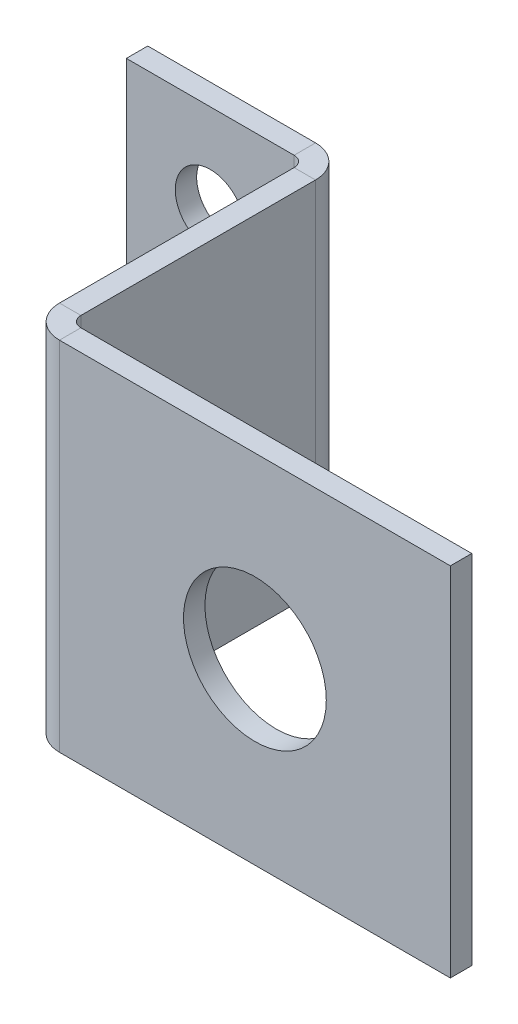
ISO-10303-21;
HEADER;
FILE_DESCRIPTION(('STEP AP214'),'2;1');
FILE_NAME('part.step','',(''),(''),'','','');
FILE_SCHEMA(('AUTOMOTIVE_DESIGN { 1 0 10303 214 1 1 1 1 }'));
ENDSEC;
DATA;
#1=APPLICATION_CONTEXT('core data for automotive mechanical design processes');
#2=APPLICATION_PROTOCOL_DEFINITION('international standard','automotive_design',2000,#1);
#3=PRODUCT_CONTEXT('',#1,'mechanical');
#4=PRODUCT('Part','Part','',(#3));
#5=PRODUCT_RELATED_PRODUCT_CATEGORY('part','',(#4));
#6=PRODUCT_DEFINITION_FORMATION('','',#4);
#7=PRODUCT_DEFINITION_CONTEXT('part definition',#1,'design');
#8=PRODUCT_DEFINITION('design','',#6,#7);
#9=PRODUCT_DEFINITION_SHAPE('','',#8);
#10=(LENGTH_UNIT() NAMED_UNIT(*) SI_UNIT(.MILLI.,.METRE.));
#11=(NAMED_UNIT(*) PLANE_ANGLE_UNIT() SI_UNIT($,.RADIAN.));
#12=(NAMED_UNIT(*) SI_UNIT($,.STERADIAN.) SOLID_ANGLE_UNIT());
#13=UNCERTAINTY_MEASURE_WITH_UNIT(LENGTH_MEASURE(1.E-05),#10,'distance_accuracy_value','');
#14=(GEOMETRIC_REPRESENTATION_CONTEXT(3) GLOBAL_UNCERTAINTY_ASSIGNED_CONTEXT((#13)) GLOBAL_UNIT_ASSIGNED_CONTEXT((#10,
#11,#12)) REPRESENTATION_CONTEXT('',''));
#15=CARTESIAN_POINT('',(0.,0.,0.));
#16=DIRECTION('',(0.,0.,1.));
#17=DIRECTION('',(1.,0.,0.));
#18=AXIS2_PLACEMENT_3D('',#15,#16,#17);
#19=CARTESIAN_POINT('',(14.224,0.,0.));
#20=DIRECTION('',(0.,1.,0.));
#21=DIRECTION('',(0.,0.,1.));
#22=AXIS2_PLACEMENT_3D('',#19,#20,#21);
#23=PLANE('',#22);
#24=DIRECTION('',(-1.,0.,0.));
#25=VECTOR('',#24,1.);
#26=CARTESIAN_POINT('',(14.2240000000001,0.,17.45841314));
#27=LINE('',#26,#25);
#28=CARTESIAN_POINT('',(14.2240000000001,0.,17.45841314));
#29=VERTEX_POINT('',#28);
#30=CARTESIAN_POINT('',(12.7000000000001,0.,17.45841314));
#31=VERTEX_POINT('',#30);
#32=EDGE_CURVE('E178',#29,#31,#27,.T.);
#33=ORIENTED_EDGE('',*,*,#32,.T.);
#34=DIRECTION('',(0.,0.,-1.));
#35=VECTOR('',#34,1.);
#36=CARTESIAN_POINT('',(12.7,0.,0.));
#37=LINE('',#36,#35);
#38=CARTESIAN_POINT('',(12.7,0.,0.761999999999997));
#39=VERTEX_POINT('',#38);
#40=EDGE_CURVE('E198',#31,#39,#37,.T.);
#41=ORIENTED_EDGE('',*,*,#40,.T.);
#42=DIRECTION('',(1.,0.,0.));
#43=VECTOR('',#42,1.);
#44=CARTESIAN_POINT('',(12.7,0.,0.761999999999997));
#45=LINE('',#44,#43);
#46=CARTESIAN_POINT('',(14.224,0.,0.761999999999991));
#47=VERTEX_POINT('',#46);
#48=EDGE_CURVE('E187',#39,#47,#45,.T.);
#49=ORIENTED_EDGE('',*,*,#48,.T.);
#50=DIRECTION('',(0.,0.,-1.));
#51=VECTOR('',#50,1.);
#52=CARTESIAN_POINT('',(14.224,0.,0.));
#53=LINE('',#52,#51);
#54=EDGE_CURVE('E199',#29,#47,#53,.T.);
#55=ORIENTED_EDGE('',*,*,#54,.F.);
#56=EDGE_LOOP('',(#33,#41,#49,#55));
#57=FACE_BOUND('',#56,.T.);
#58=ADVANCED_FACE('F38',(#57),#23,.F.);
#59=CARTESIAN_POINT('',(14.2240000000001,25.4,18.22041314));
#60=DIRECTION('',(0.,-1.,0.));
#61=DIRECTION('',(0.,0.,-1.));
#62=AXIS2_PLACEMENT_3D('',#59,#60,#61);
#63=PLANE('',#62);
#64=DIRECTION('',(-1.,0.,0.));
#65=VECTOR('',#64,1.);
#66=CARTESIAN_POINT('',(14.2240000000001,25.4,17.45841314));
#67=LINE('',#66,#65);
#68=CARTESIAN_POINT('',(14.2240000000001,25.4,17.45841314));
#69=VERTEX_POINT('',#68);
#70=CARTESIAN_POINT('',(12.7000000000001,25.4,17.45841314));
#71=VERTEX_POINT('',#70);
#72=EDGE_CURVE('E185',#69,#71,#67,.T.);
#73=ORIENTED_EDGE('',*,*,#72,.F.);
#74=DIRECTION('',(0.,0.,1.));
#75=VECTOR('',#74,1.);
#76=CARTESIAN_POINT('',(14.2240000000001,25.4,18.22041314));
#77=LINE('',#76,#75);
#78=CARTESIAN_POINT('',(14.224,25.4,0.761999999999993));
#79=VERTEX_POINT('',#78);
#80=EDGE_CURVE('E201',#79,#69,#77,.T.);
#81=ORIENTED_EDGE('',*,*,#80,.F.);
#82=DIRECTION('',(1.,0.,0.));
#83=VECTOR('',#82,1.);
#84=CARTESIAN_POINT('',(12.7,25.4,0.761999999999999));
#85=LINE('',#84,#83);
#86=CARTESIAN_POINT('',(12.7,25.4,0.761999999999999));
#87=VERTEX_POINT('',#86);
#88=EDGE_CURVE('E191',#87,#79,#85,.T.);
#89=ORIENTED_EDGE('',*,*,#88,.F.);
#90=DIRECTION('',(0.,0.,1.));
#91=VECTOR('',#90,1.);
#92=CARTESIAN_POINT('',(12.7000000000001,25.4,18.22041314));
#93=LINE('',#92,#91);
#94=EDGE_CURVE('E202',#87,#71,#93,.T.);
#95=ORIENTED_EDGE('',*,*,#94,.T.);
#96=EDGE_LOOP('',(#73,#81,#89,#95));
#97=FACE_BOUND('',#96,.T.);
#98=ADVANCED_FACE('F279',(#97),#63,.F.);
#99=CARTESIAN_POINT('',(14.224,0.,0.));
#100=DIRECTION('',(-1.,0.,0.));
#101=DIRECTION('',(0.,0.,1.));
#102=AXIS2_PLACEMENT_3D('',#99,#100,#101);
#103=PLANE('',#102);
#104=DIRECTION('',(0.,-1.,0.));
#105=VECTOR('',#104,1.);
#106=CARTESIAN_POINT('',(14.2240000000001,0.,17.45841314));
#107=LINE('',#106,#105);
#108=EDGE_CURVE('E182',#29,#69,#107,.F.);
#109=ORIENTED_EDGE('',*,*,#108,.F.);
#110=ORIENTED_EDGE('',*,*,#54,.T.);
#111=DIRECTION('',(0.,-1.,0.));
#112=VECTOR('',#111,1.);
#113=CARTESIAN_POINT('',(14.224,0.,0.761999999999992));
#114=LINE('',#113,#112);
#115=EDGE_CURVE('E194',#79,#47,#114,.T.);
#116=ORIENTED_EDGE('',*,*,#115,.F.);
#117=ORIENTED_EDGE('',*,*,#80,.T.);
#118=EDGE_LOOP('',(#109,#110,#116,#117));
#119=FACE_BOUND('',#118,.T.);
#120=ADVANCED_FACE('F276',(#119),#103,.F.);
#121=CARTESIAN_POINT('',(12.7,0.,0.));
#122=DIRECTION('',(-1.,0.,0.));
#123=DIRECTION('',(0.,0.,1.));
#124=AXIS2_PLACEMENT_3D('',#121,#122,#123);
#125=PLANE('',#124);
#126=ORIENTED_EDGE('',*,*,#40,.F.);
#127=DIRECTION('',(0.,-1.,0.));
#128=VECTOR('',#127,1.);
#129=CARTESIAN_POINT('',(12.7000000000001,0.,17.45841314));
#130=LINE('',#129,#128);
#131=EDGE_CURVE('E132',#31,#71,#130,.F.);
#132=ORIENTED_EDGE('',*,*,#131,.T.);
#133=ORIENTED_EDGE('',*,*,#94,.F.);
#134=DIRECTION('',(0.,1.,0.));
#135=VECTOR('',#134,1.);
#136=CARTESIAN_POINT('',(12.7,0.,0.761999999999997));
#137=LINE('',#136,#135);
#138=EDGE_CURVE('E189',#39,#87,#137,.T.);
#139=ORIENTED_EDGE('',*,*,#138,.F.);
#140=EDGE_LOOP('',(#126,#132,#133,#139));
#141=FACE_BOUND('',#140,.T.);
#142=ADVANCED_FACE('F286',(#141),#125,.T.);
#143=CARTESIAN_POINT('',(0.,25.4,-1.524));
#144=DIRECTION('',(0.,1.,0.));
#145=DIRECTION('',(0.,0.,1.));
#146=AXIS2_PLACEMENT_3D('',#143,#144,#145);
#147=PLANE('',#146);
#148=DIRECTION('',(-1.,0.,0.));
#149=VECTOR('',#148,1.);
#150=CARTESIAN_POINT('',(0.,25.4,0.));
#151=LINE('',#150,#149);
#152=CARTESIAN_POINT('',(11.938,25.4,0.));
#153=VERTEX_POINT('',#152);
#154=CARTESIAN_POINT('',(0.,25.4,0.));
#155=VERTEX_POINT('',#154);
#156=EDGE_CURVE('E233',#153,#155,#151,.T.);
#157=ORIENTED_EDGE('',*,*,#156,.F.);
#158=DIRECTION('',(0.,0.,-1.));
#159=VECTOR('',#158,1.);
#160=CARTESIAN_POINT('',(11.938,25.4,0.));
#161=LINE('',#160,#159);
#162=CARTESIAN_POINT('',(11.938,25.4,-1.524));
#163=VERTEX_POINT('',#162);
#164=EDGE_CURVE('E214',#153,#163,#161,.T.);
#165=ORIENTED_EDGE('',*,*,#164,.T.);
#166=DIRECTION('',(-1.,0.,0.));
#167=VECTOR('',#166,1.);
#168=CARTESIAN_POINT('',(0.,25.4,-1.524));
#169=LINE('',#168,#167);
#170=CARTESIAN_POINT('',(0.,25.4,-1.524));
#171=VERTEX_POINT('',#170);
#172=EDGE_CURVE('E236',#163,#171,#169,.T.);
#173=ORIENTED_EDGE('',*,*,#172,.T.);
#174=DIRECTION('',(0.,0.,1.));
#175=VECTOR('',#174,1.);
#176=CARTESIAN_POINT('',(0.,25.4,-1.524));
#177=LINE('',#176,#175);
#178=EDGE_CURVE('E11',#171,#155,#177,.T.);
#179=ORIENTED_EDGE('',*,*,#178,.T.);
#180=EDGE_LOOP('',(#157,#165,#173,#179));
#181=FACE_BOUND('',#180,.T.);
#182=ADVANCED_FACE('F250',(#181),#147,.T.);
#183=CARTESIAN_POINT('',(0.,0.,-1.524));
#184=DIRECTION('',(0.,0.,-1.));
#185=DIRECTION('',(-1.,0.,0.));
#186=AXIS2_PLACEMENT_3D('',#183,#184,#185);
#187=PLANE('',#186);
#188=CARTESIAN_POINT('',(5.969,19.05,-1.524));
#189=DIRECTION('',(0.,0.,1.));
#190=DIRECTION('',(1.,0.,0.));
#191=AXIS2_PLACEMENT_3D('',#188,#189,#190);
#192=CIRCLE('',#191,2.4892);
#193=CARTESIAN_POINT('',(8.4582,19.05,-1.524));
#194=VERTEX_POINT('',#193);
#195=EDGE_CURVE('E352',#194,#194,#192,.T.);
#196=ORIENTED_EDGE('',*,*,#195,.T.);
#197=EDGE_LOOP('',(#196));
#198=FACE_BOUND('',#197,.T.);
#199=CARTESIAN_POINT('',(5.969,6.35,-1.524));
#200=DIRECTION('',(0.,0.,1.));
#201=DIRECTION('',(1.,0.,0.));
#202=AXIS2_PLACEMENT_3D('',#199,#200,#201);
#203=CIRCLE('',#202,2.4892);
#204=CARTESIAN_POINT('',(8.4582,6.35,-1.524));
#205=VERTEX_POINT('',#204);
#206=EDGE_CURVE('E363',#205,#205,#203,.T.);
#207=ORIENTED_EDGE('',*,*,#206,.T.);
#208=EDGE_LOOP('',(#207));
#209=FACE_BOUND('',#208,.T.);
#210=ORIENTED_EDGE('',*,*,#172,.F.);
#211=DIRECTION('',(0.,1.,0.));
#212=VECTOR('',#211,1.);
#213=CARTESIAN_POINT('',(11.938,25.4,-1.524));
#214=LINE('',#213,#212);
#215=CARTESIAN_POINT('',(11.938,0.,-1.524));
#216=VERTEX_POINT('',#215);
#217=EDGE_CURVE('E209',#163,#216,#214,.F.);
#218=ORIENTED_EDGE('',*,*,#217,.T.);
#219=DIRECTION('',(1.,0.,0.));
#220=VECTOR('',#219,1.);
#221=CARTESIAN_POINT('',(0.,0.,-1.524));
#222=LINE('',#221,#220);
#223=CARTESIAN_POINT('',(0.,0.,-1.524));
#224=VERTEX_POINT('',#223);
#225=EDGE_CURVE('E232',#224,#216,#222,.T.);
#226=ORIENTED_EDGE('',*,*,#225,.F.);
#227=DIRECTION('',(0.,-1.,0.));
#228=VECTOR('',#227,1.);
#229=CARTESIAN_POINT('',(0.,0.,-1.524));
#230=LINE('',#229,#228);
#231=EDGE_CURVE('E229',#171,#224,#230,.T.);
#232=ORIENTED_EDGE('',*,*,#231,.F.);
#233=EDGE_LOOP('',(#210,#218,#226,#232));
#234=FACE_BOUND('',#233,.T.);
#235=ADVANCED_FACE('F264',(#198,#209,#234),#187,.T.);
#236=CARTESIAN_POINT('',(0.,0.,0.));
#237=DIRECTION('',(0.,0.,-1.));
#238=DIRECTION('',(-1.,0.,0.));
#239=AXIS2_PLACEMENT_3D('',#236,#237,#238);
#240=PLANE('',#239);
#241=CARTESIAN_POINT('',(5.969,19.05,0.));
#242=DIRECTION('',(0.,0.,1.));
#243=DIRECTION('',(1.,0.,0.));
#244=AXIS2_PLACEMENT_3D('',#241,#242,#243);
#245=CIRCLE('',#244,2.48919999999999);
#246=CARTESIAN_POINT('',(8.45819999999999,19.05,0.));
#247=VERTEX_POINT('',#246);
#248=EDGE_CURVE('E355',#247,#247,#245,.T.);
#249=ORIENTED_EDGE('',*,*,#248,.F.);
#250=EDGE_LOOP('',(#249));
#251=FACE_BOUND('',#250,.T.);
#252=CARTESIAN_POINT('',(5.969,6.35,0.));
#253=DIRECTION('',(0.,0.,1.));
#254=DIRECTION('',(1.,0.,0.));
#255=AXIS2_PLACEMENT_3D('',#252,#253,#254);
#256=CIRCLE('',#255,2.48919999999999);
#257=CARTESIAN_POINT('',(8.45819999999999,6.35,0.));
#258=VERTEX_POINT('',#257);
#259=EDGE_CURVE('E358',#258,#258,#256,.T.);
#260=ORIENTED_EDGE('',*,*,#259,.F.);
#261=EDGE_LOOP('',(#260));
#262=FACE_BOUND('',#261,.T.);
#263=DIRECTION('',(0.,1.,0.));
#264=VECTOR('',#263,1.);
#265=CARTESIAN_POINT('',(11.938,25.4,0.));
#266=LINE('',#265,#264);
#267=CARTESIAN_POINT('',(11.938,0.,0.));
#268=VERTEX_POINT('',#267);
#269=EDGE_CURVE('E220',#153,#268,#266,.F.);
#270=ORIENTED_EDGE('',*,*,#269,.F.);
#271=ORIENTED_EDGE('',*,*,#156,.T.);
#272=DIRECTION('',(0.,-1.,0.));
#273=VECTOR('',#272,1.);
#274=CARTESIAN_POINT('',(0.,0.,0.));
#275=LINE('',#274,#273);
#276=CARTESIAN_POINT('',(0.,0.,0.));
#277=VERTEX_POINT('',#276);
#278=EDGE_CURVE('E226',#155,#277,#275,.T.);
#279=ORIENTED_EDGE('',*,*,#278,.T.);
#280=DIRECTION('',(1.,0.,0.));
#281=VECTOR('',#280,1.);
#282=CARTESIAN_POINT('',(0.,0.,0.));
#283=LINE('',#282,#281);
#284=EDGE_CURVE('E240',#277,#268,#283,.T.);
#285=ORIENTED_EDGE('',*,*,#284,.T.);
#286=EDGE_LOOP('',(#270,#271,#279,#285));
#287=FACE_BOUND('',#286,.T.);
#288=ADVANCED_FACE('F246',(#251,#262,#287),#240,.F.);
#289=CARTESIAN_POINT('',(0.,0.,-1.524));
#290=DIRECTION('',(-1.,0.,0.));
#291=DIRECTION('',(0.,0.,1.));
#292=AXIS2_PLACEMENT_3D('',#289,#290,#291);
#293=PLANE('',#292);
#294=ORIENTED_EDGE('',*,*,#278,.F.);
#295=ORIENTED_EDGE('',*,*,#178,.F.);
#296=ORIENTED_EDGE('',*,*,#231,.T.);
#297=DIRECTION('',(0.,0.,1.));
#298=VECTOR('',#297,1.);
#299=CARTESIAN_POINT('',(0.,0.,-1.524));
#300=LINE('',#299,#298);
#301=EDGE_CURVE('E42',#224,#277,#300,.T.);
#302=ORIENTED_EDGE('',*,*,#301,.T.);
#303=EDGE_LOOP('',(#294,#295,#296,#302));
#304=FACE_BOUND('',#303,.T.);
#305=ADVANCED_FACE('F40',(#304),#293,.T.);
#306=CARTESIAN_POINT('',(0.,0.,-1.524));
#307=DIRECTION('',(0.,-1.,0.));
#308=DIRECTION('',(0.,0.,-1.));
#309=AXIS2_PLACEMENT_3D('',#306,#307,#308);
#310=PLANE('',#309);
#311=DIRECTION('',(0.,0.,-1.));
#312=VECTOR('',#311,1.);
#313=CARTESIAN_POINT('',(11.938,0.,0.));
#314=LINE('',#313,#312);
#315=EDGE_CURVE('E224',#268,#216,#314,.T.);
#316=ORIENTED_EDGE('',*,*,#315,.F.);
#317=ORIENTED_EDGE('',*,*,#284,.F.);
#318=ORIENTED_EDGE('',*,*,#301,.F.);
#319=ORIENTED_EDGE('',*,*,#225,.T.);
#320=EDGE_LOOP('',(#316,#317,#318,#319));
#321=FACE_BOUND('',#320,.T.);
#322=ADVANCED_FACE('F258',(#321),#310,.T.);
#323=CARTESIAN_POINT('',(11.938,0.,0.762));
#324=DIRECTION('',(0.,-1.,0.));
#325=DIRECTION('',(0.,0.,-1.));
#326=AXIS2_PLACEMENT_3D('',#323,#324,#325);
#327=PLANE('',#326);
#328=ORIENTED_EDGE('',*,*,#48,.F.);
#329=CARTESIAN_POINT('',(11.938,0.,0.762));
#330=DIRECTION('',(0.,1.,0.));
#331=DIRECTION('',(0.,0.,1.));
#332=AXIS2_PLACEMENT_3D('',#329,#330,#331);
#333=CIRCLE('',#332,0.762000000000001);
#334=EDGE_CURVE('E217',#268,#39,#333,.F.);
#335=ORIENTED_EDGE('',*,*,#334,.F.);
#336=ORIENTED_EDGE('',*,*,#315,.T.);
#337=CARTESIAN_POINT('',(11.938,0.,0.762));
#338=DIRECTION('',(0.,1.,0.));
#339=DIRECTION('',(0.,0.,1.));
#340=AXIS2_PLACEMENT_3D('',#337,#338,#339);
#341=CIRCLE('',#340,2.286);
#342=EDGE_CURVE('E61',#216,#47,#341,.F.);
#343=ORIENTED_EDGE('',*,*,#342,.T.);
#344=EDGE_LOOP('',(#328,#335,#336,#343));
#345=FACE_BOUND('',#344,.T.);
#346=ADVANCED_FACE('F262',(#345),#327,.T.);
#347=CARTESIAN_POINT('',(11.938,25.4,0.762000000000001));
#348=DIRECTION('',(0.,-1.,0.));
#349=DIRECTION('',(0.,0.,-1.));
#350=AXIS2_PLACEMENT_3D('',#347,#348,#349);
#351=PLANE('',#350);
#352=CARTESIAN_POINT('',(11.938,25.4,0.762000000000001));
#353=DIRECTION('',(0.,1.,0.));
#354=DIRECTION('',(0.,0.,1.));
#355=AXIS2_PLACEMENT_3D('',#352,#353,#354);
#356=CIRCLE('',#355,0.762000000000001);
#357=EDGE_CURVE('E205',#87,#153,#356,.T.);
#358=ORIENTED_EDGE('',*,*,#357,.F.);
#359=ORIENTED_EDGE('',*,*,#88,.T.);
#360=CARTESIAN_POINT('',(11.938,25.4,0.762000000000001));
#361=DIRECTION('',(0.,1.,0.));
#362=DIRECTION('',(0.,0.,1.));
#363=AXIS2_PLACEMENT_3D('',#360,#361,#362);
#364=CIRCLE('',#363,2.286);
#365=EDGE_CURVE('E212',#79,#163,#364,.T.);
#366=ORIENTED_EDGE('',*,*,#365,.T.);
#367=ORIENTED_EDGE('',*,*,#164,.F.);
#368=EDGE_LOOP('',(#358,#359,#366,#367));
#369=FACE_BOUND('',#368,.T.);
#370=ADVANCED_FACE('F268',(#369),#351,.F.);
#371=CARTESIAN_POINT('',(11.938,25.4,0.762000000000001));
#372=DIRECTION('',(0.,1.,0.));
#373=DIRECTION('',(1.,0.,0.));
#374=AXIS2_PLACEMENT_3D('',#371,#372,#373);
#375=CYLINDRICAL_SURFACE('',#374,2.286);
#376=ORIENTED_EDGE('',*,*,#217,.F.);
#377=ORIENTED_EDGE('',*,*,#365,.F.);
#378=ORIENTED_EDGE('',*,*,#115,.T.);
#379=ORIENTED_EDGE('',*,*,#342,.F.);
#380=EDGE_LOOP('',(#376,#377,#378,#379));
#381=FACE_BOUND('',#380,.T.);
#382=ADVANCED_FACE('F265',(#381),#375,.T.);
#383=CARTESIAN_POINT('',(11.938,25.4,0.762000000000001));
#384=DIRECTION('',(0.,1.,0.));
#385=DIRECTION('',(1.,0.,0.));
#386=AXIS2_PLACEMENT_3D('',#383,#384,#385);
#387=CYLINDRICAL_SURFACE('',#386,0.762000000000001);
#388=ORIENTED_EDGE('',*,*,#269,.T.);
#389=ORIENTED_EDGE('',*,*,#334,.T.);
#390=ORIENTED_EDGE('',*,*,#138,.T.);
#391=ORIENTED_EDGE('',*,*,#357,.T.);
#392=EDGE_LOOP('',(#388,#389,#390,#391));
#393=FACE_BOUND('',#392,.T.);
#394=ADVANCED_FACE('F290',(#393),#387,.F.);
#395=CARTESIAN_POINT('',(14.9860000000001,25.4,17.45841314));
#396=DIRECTION('',(0.,1.,0.));
#397=DIRECTION('',(0.,0.,1.));
#398=AXIS2_PLACEMENT_3D('',#395,#396,#397);
#399=PLANE('',#398);
#400=DIRECTION('',(0.,0.,1.));
#401=VECTOR('',#400,1.);
#402=CARTESIAN_POINT('',(14.9860000000001,25.4,18.22041314));
#403=LINE('',#402,#401);
#404=CARTESIAN_POINT('',(14.9860000000001,25.4,18.22041314));
#405=VERTEX_POINT('',#404);
#406=CARTESIAN_POINT('',(14.9860000000001,25.4,19.74441314));
#407=VERTEX_POINT('',#406);
#408=EDGE_CURVE('E370',#405,#407,#403,.T.);
#409=ORIENTED_EDGE('',*,*,#408,.F.);
#410=CARTESIAN_POINT('',(14.9860000000001,25.4,17.45841314));
#411=DIRECTION('',(0.,-1.,0.));
#412=DIRECTION('',(0.,0.,-1.));
#413=AXIS2_PLACEMENT_3D('',#410,#411,#412);
#414=CIRCLE('',#413,0.762000000000002);
#415=EDGE_CURVE('E135',#69,#405,#414,.F.);
#416=ORIENTED_EDGE('',*,*,#415,.F.);
#417=ORIENTED_EDGE('',*,*,#72,.T.);
#418=CARTESIAN_POINT('',(14.9860000000001,25.4,17.45841314));
#419=DIRECTION('',(0.,-1.,0.));
#420=DIRECTION('',(0.,0.,-1.));
#421=AXIS2_PLACEMENT_3D('',#418,#419,#420);
#422=CIRCLE('',#421,2.286);
#423=EDGE_CURVE('E53',#71,#407,#422,.F.);
#424=ORIENTED_EDGE('',*,*,#423,.T.);
#425=EDGE_LOOP('',(#409,#416,#417,#424));
#426=FACE_BOUND('',#425,.T.);
#427=ADVANCED_FACE('F282',(#426),#399,.T.);
#428=CARTESIAN_POINT('',(14.9860000000001,0.,17.45841314));
#429=DIRECTION('',(0.,1.,0.));
#430=DIRECTION('',(0.,0.,1.));
#431=AXIS2_PLACEMENT_3D('',#428,#429,#430);
#432=PLANE('',#431);
#433=CARTESIAN_POINT('',(14.9860000000001,0.,17.45841314));
#434=DIRECTION('',(0.,-1.,0.));
#435=DIRECTION('',(0.,0.,-1.));
#436=AXIS2_PLACEMENT_3D('',#433,#434,#435);
#437=CIRCLE('',#436,0.762000000000002);
#438=CARTESIAN_POINT('',(14.9860000000001,0.,18.22041314));
#439=VERTEX_POINT('',#438);
#440=EDGE_CURVE('E142',#439,#29,#437,.T.);
#441=ORIENTED_EDGE('',*,*,#440,.F.);
#442=DIRECTION('',(0.,0.,1.));
#443=VECTOR('',#442,1.);
#444=CARTESIAN_POINT('',(14.9860000000001,0.,18.22041314));
#445=LINE('',#444,#443);
#446=CARTESIAN_POINT('',(14.9860000000001,0.,19.74441314));
#447=VERTEX_POINT('',#446);
#448=EDGE_CURVE('E139',#439,#447,#445,.T.);
#449=ORIENTED_EDGE('',*,*,#448,.T.);
#450=CARTESIAN_POINT('',(14.9860000000001,0.,17.45841314));
#451=DIRECTION('',(0.,-1.,0.));
#452=DIRECTION('',(0.,0.,-1.));
#453=AXIS2_PLACEMENT_3D('',#450,#451,#452);
#454=CIRCLE('',#453,2.286);
#455=EDGE_CURVE('E126',#447,#31,#454,.T.);
#456=ORIENTED_EDGE('',*,*,#455,.T.);
#457=ORIENTED_EDGE('',*,*,#32,.F.);
#458=EDGE_LOOP('',(#441,#449,#456,#457));
#459=FACE_BOUND('',#458,.T.);
#460=ADVANCED_FACE('F140',(#459),#432,.F.);
#461=CARTESIAN_POINT('',(14.9860000000001,0.,17.45841314));
#462=DIRECTION('',(0.,-1.,0.));
#463=DIRECTION('',(0.,0.,1.));
#464=AXIS2_PLACEMENT_3D('',#461,#462,#463);
#465=CYLINDRICAL_SURFACE('',#464,2.286);
#466=ORIENTED_EDGE('',*,*,#131,.F.);
#467=ORIENTED_EDGE('',*,*,#455,.F.);
#468=DIRECTION('',(0.,1.,0.));
#469=VECTOR('',#468,1.);
#470=CARTESIAN_POINT('',(14.9860000000001,0.,19.74441314));
#471=LINE('',#470,#469);
#472=EDGE_CURVE('E130',#447,#407,#471,.T.);
#473=ORIENTED_EDGE('',*,*,#472,.T.);
#474=ORIENTED_EDGE('',*,*,#423,.F.);
#475=EDGE_LOOP('',(#466,#467,#473,#474));
#476=FACE_BOUND('',#475,.T.);
#477=ADVANCED_FACE('F128',(#476),#465,.T.);
#478=CARTESIAN_POINT('',(14.9860000000001,0.,17.45841314));
#479=DIRECTION('',(0.,-1.,0.));
#480=DIRECTION('',(0.,0.,1.));
#481=AXIS2_PLACEMENT_3D('',#478,#479,#480);
#482=CYLINDRICAL_SURFACE('',#481,0.762000000000002);
#483=ORIENTED_EDGE('',*,*,#108,.T.);
#484=ORIENTED_EDGE('',*,*,#415,.T.);
#485=DIRECTION('',(0.,-1.,0.));
#486=VECTOR('',#485,1.);
#487=CARTESIAN_POINT('',(14.9860000000001,25.4,18.22041314));
#488=LINE('',#487,#486);
#489=EDGE_CURVE('E146',#405,#439,#488,.T.);
#490=ORIENTED_EDGE('',*,*,#489,.T.);
#491=ORIENTED_EDGE('',*,*,#440,.T.);
#492=EDGE_LOOP('',(#483,#484,#490,#491));
#493=FACE_BOUND('',#492,.T.);
#494=ADVANCED_FACE('F313',(#493),#482,.F.);
#495=CARTESIAN_POINT('',(42.7990000000001,0.,19.74441314));
#496=DIRECTION('',(0.,1.,0.));
#497=DIRECTION('',(-1.,0.,0.));
#498=AXIS2_PLACEMENT_3D('',#495,#496,#497);
#499=PLANE('',#498);
#500=ORIENTED_EDGE('',*,*,#448,.F.);
#501=DIRECTION('',(1.,0.,0.));
#502=VECTOR('',#501,1.);
#503=CARTESIAN_POINT('',(42.7990000000001,0.,18.22041314));
#504=LINE('',#503,#502);
#505=CARTESIAN_POINT('',(42.7990000000001,0.,18.22041314));
#506=VERTEX_POINT('',#505);
#507=EDGE_CURVE('E155',#439,#506,#504,.T.);
#508=ORIENTED_EDGE('',*,*,#507,.T.);
#509=DIRECTION('',(0.,0.,-1.));
#510=VECTOR('',#509,1.);
#511=CARTESIAN_POINT('',(42.7990000000001,0.,19.74441314));
#512=LINE('',#511,#510);
#513=CARTESIAN_POINT('',(42.7990000000001,0.,19.74441314));
#514=VERTEX_POINT('',#513);
#515=EDGE_CURVE('E159',#514,#506,#512,.T.);
#516=ORIENTED_EDGE('',*,*,#515,.F.);
#517=DIRECTION('',(1.,0.,0.));
#518=VECTOR('',#517,1.);
#519=CARTESIAN_POINT('',(42.7990000000001,0.,19.74441314));
#520=LINE('',#519,#518);
#521=EDGE_CURVE('E151',#447,#514,#520,.T.);
#522=ORIENTED_EDGE('',*,*,#521,.F.);
#523=EDGE_LOOP('',(#500,#508,#516,#522));
#524=FACE_BOUND('',#523,.T.);
#525=ADVANCED_FACE('F157',(#524),#499,.F.);
#526=CARTESIAN_POINT('',(14.2240000000001,25.4,19.74441314));
#527=DIRECTION('',(0.,-1.,0.));
#528=DIRECTION('',(0.,0.,-1.));
#529=AXIS2_PLACEMENT_3D('',#526,#527,#528);
#530=PLANE('',#529);
#531=ORIENTED_EDGE('',*,*,#408,.T.);
#532=DIRECTION('',(-1.,0.,0.));
#533=VECTOR('',#532,1.);
#534=CARTESIAN_POINT('',(14.2240000000001,25.4,19.74441314));
#535=LINE('',#534,#533);
#536=CARTESIAN_POINT('',(42.7990000000001,25.4,19.74441314));
#537=VERTEX_POINT('',#536);
#538=EDGE_CURVE('E154',#537,#407,#535,.T.);
#539=ORIENTED_EDGE('',*,*,#538,.F.);
#540=DIRECTION('',(0.,0.,-1.));
#541=VECTOR('',#540,1.);
#542=CARTESIAN_POINT('',(42.7990000000001,25.4,19.74441314));
#543=LINE('',#542,#541);
#544=CARTESIAN_POINT('',(42.7990000000001,25.4,18.22041314));
#545=VERTEX_POINT('',#544);
#546=EDGE_CURVE('E171',#537,#545,#543,.T.);
#547=ORIENTED_EDGE('',*,*,#546,.T.);
#548=DIRECTION('',(-1.,0.,0.));
#549=VECTOR('',#548,1.);
#550=CARTESIAN_POINT('',(14.2240000000001,25.4,18.22041314));
#551=LINE('',#550,#549);
#552=EDGE_CURVE('E162',#545,#405,#551,.T.);
#553=ORIENTED_EDGE('',*,*,#552,.T.);
#554=EDGE_LOOP('',(#531,#539,#547,#553));
#555=FACE_BOUND('',#554,.T.);
#556=ADVANCED_FACE('F321',(#555),#530,.F.);
#557=CARTESIAN_POINT('',(0.,0.,19.74441314));
#558=DIRECTION('',(0.,0.,-1.));
#559=DIRECTION('',(-1.,0.,0.));
#560=AXIS2_PLACEMENT_3D('',#557,#558,#559);
#561=PLANE('',#560);
#562=CARTESIAN_POINT('',(28.8925000000001,12.7,19.74441314));
#563=DIRECTION('',(0.,0.,1.));
#564=DIRECTION('',(1.,0.,0.));
#565=AXIS2_PLACEMENT_3D('',#562,#563,#564);
#566=CIRCLE('',#565,5.08000000000001);
#567=CARTESIAN_POINT('',(33.9725000000001,12.7,19.74441314));
#568=VERTEX_POINT('',#567);
#569=EDGE_CURVE('E367',#568,#568,#566,.T.);
#570=ORIENTED_EDGE('',*,*,#569,.F.);
#571=EDGE_LOOP('',(#570));
#572=FACE_BOUND('',#571,.T.);
#573=ORIENTED_EDGE('',*,*,#472,.F.);
#574=ORIENTED_EDGE('',*,*,#521,.T.);
#575=DIRECTION('',(0.,1.,0.));
#576=VECTOR('',#575,1.);
#577=CARTESIAN_POINT('',(42.7990000000001,25.4,19.74441314));
#578=LINE('',#577,#576);
#579=EDGE_CURVE('E161',#514,#537,#578,.T.);
#580=ORIENTED_EDGE('',*,*,#579,.T.);
#581=ORIENTED_EDGE('',*,*,#538,.T.);
#582=EDGE_LOOP('',(#573,#574,#580,#581));
#583=FACE_BOUND('',#582,.T.);
#584=ADVANCED_FACE('F150',(#572,#583),#561,.F.);
#585=CARTESIAN_POINT('',(0.,0.,18.22041314));
#586=DIRECTION('',(0.,0.,-1.));
#587=DIRECTION('',(-1.,0.,0.));
#588=AXIS2_PLACEMENT_3D('',#585,#586,#587);
#589=PLANE('',#588);
#590=CARTESIAN_POINT('',(28.8925000000001,12.7,18.22041314));
#591=DIRECTION('',(0.,0.,-1.));
#592=DIRECTION('',(-1.,0.,0.));
#593=AXIS2_PLACEMENT_3D('',#590,#591,#592);
#594=CIRCLE('',#593,5.08000000000001);
#595=CARTESIAN_POINT('',(23.8125,12.7,18.22041314));
#596=VERTEX_POINT('',#595);
#597=EDGE_CURVE('E366',#596,#596,#594,.F.);
#598=ORIENTED_EDGE('',*,*,#597,.T.);
#599=EDGE_LOOP('',(#598));
#600=FACE_BOUND('',#599,.T.);
#601=ORIENTED_EDGE('',*,*,#507,.F.);
#602=ORIENTED_EDGE('',*,*,#489,.F.);
#603=ORIENTED_EDGE('',*,*,#552,.F.);
#604=DIRECTION('',(0.,1.,0.));
#605=VECTOR('',#604,1.);
#606=CARTESIAN_POINT('',(42.7990000000001,25.4,18.22041314));
#607=LINE('',#606,#605);
#608=EDGE_CURVE('E166',#506,#545,#607,.T.);
#609=ORIENTED_EDGE('',*,*,#608,.F.);
#610=EDGE_LOOP('',(#601,#602,#603,#609));
#611=FACE_BOUND('',#610,.T.);
#612=ADVANCED_FACE('F326',(#600,#611),#589,.T.);
#613=CARTESIAN_POINT('',(42.7990000000001,25.4,19.74441314));
#614=DIRECTION('',(-1.,0.,0.));
#615=DIRECTION('',(0.,0.,1.));
#616=AXIS2_PLACEMENT_3D('',#613,#614,#615);
#617=PLANE('',#616);
#618=ORIENTED_EDGE('',*,*,#608,.T.);
#619=ORIENTED_EDGE('',*,*,#546,.F.);
#620=ORIENTED_EDGE('',*,*,#579,.F.);
#621=ORIENTED_EDGE('',*,*,#515,.T.);
#622=EDGE_LOOP('',(#618,#619,#620,#621));
#623=FACE_BOUND('',#622,.T.);
#624=ADVANCED_FACE('F322',(#623),#617,.F.);
#625=CARTESIAN_POINT('',(28.8925000000001,12.7,-1.525));
#626=DIRECTION('',(0.,0.,1.));
#627=DIRECTION('',(1.,0.,0.));
#628=AXIS2_PLACEMENT_3D('',#625,#626,#627);
#629=CYLINDRICAL_SURFACE('',#628,5.08000000000001);
#630=ORIENTED_EDGE('',*,*,#597,.F.);
#631=EDGE_LOOP('',(#630));
#632=FACE_BOUND('',#631,.T.);
#633=ORIENTED_EDGE('',*,*,#569,.T.);
#634=EDGE_LOOP('',(#633));
#635=FACE_BOUND('',#634,.T.);
#636=ADVANCED_FACE('F325',(#632,#635),#629,.F.);
#637=CARTESIAN_POINT('',(5.969,6.35,0.));
#638=DIRECTION('',(0.,0.,1.));
#639=DIRECTION('',(1.,0.,0.));
#640=AXIS2_PLACEMENT_3D('',#637,#638,#639);
#641=CYLINDRICAL_SURFACE('',#640,2.48919999999999);
#642=ORIENTED_EDGE('',*,*,#206,.F.);
#643=EDGE_LOOP('',(#642));
#644=FACE_BOUND('',#643,.T.);
#645=ORIENTED_EDGE('',*,*,#259,.T.);
#646=EDGE_LOOP('',(#645));
#647=FACE_BOUND('',#646,.T.);
#648=ADVANCED_FACE('F339',(#644,#647),#641,.F.);
#649=CARTESIAN_POINT('',(5.969,19.05,0.));
#650=DIRECTION('',(0.,0.,1.));
#651=DIRECTION('',(1.,0.,0.));
#652=AXIS2_PLACEMENT_3D('',#649,#650,#651);
#653=CYLINDRICAL_SURFACE('',#652,2.48919999999999);
#654=ORIENTED_EDGE('',*,*,#195,.F.);
#655=EDGE_LOOP('',(#654));
#656=FACE_BOUND('',#655,.T.);
#657=ORIENTED_EDGE('',*,*,#248,.T.);
#658=EDGE_LOOP('',(#657));
#659=FACE_BOUND('',#658,.T.);
#660=ADVANCED_FACE('F343',(#656,#659),#653,.F.);
#661=CLOSED_SHELL('',(#58,#98,#120,#142,#182,#235,#288,#305,#322,#346,#370,#382,#394,#427,#460,
#477,#494,#525,#556,#584,#612,#624,#636,#648,#660));
#662=MANIFOLD_SOLID_BREP('B2',#661);
#663=ADVANCED_BREP_SHAPE_REPRESENTATION('',(#18,#662),#14);
#664=SHAPE_DEFINITION_REPRESENTATION(#9,#663);
ENDSEC;
END-ISO-10303-21;
